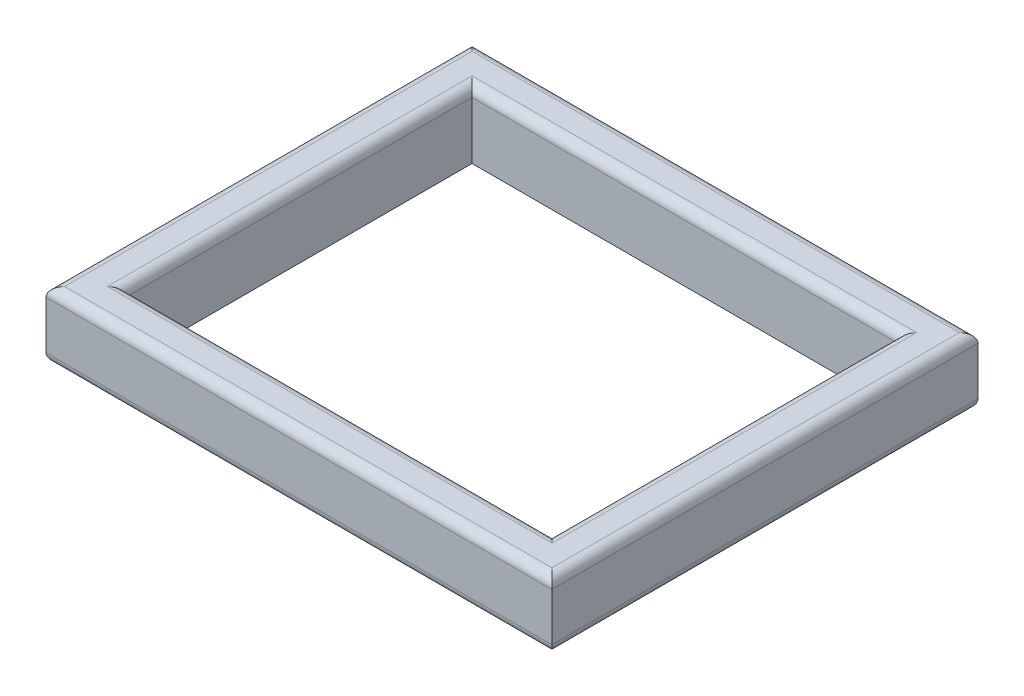
ISO-10303-21;
HEADER;
FILE_DESCRIPTION(('STEP AP214'),'2;1');
FILE_NAME('part.step','',(''),(''),'','','');
FILE_SCHEMA(('AUTOMOTIVE_DESIGN { 1 0 10303 214 1 1 1 1 }'));
ENDSEC;
DATA;
#1=APPLICATION_CONTEXT('core data for automotive mechanical design processes');
#2=APPLICATION_PROTOCOL_DEFINITION('international standard','automotive_design',2000,#1);
#3=PRODUCT_CONTEXT('',#1,'mechanical');
#4=PRODUCT('Part','Part','',(#3));
#5=PRODUCT_RELATED_PRODUCT_CATEGORY('part','',(#4));
#6=PRODUCT_DEFINITION_FORMATION('','',#4);
#7=PRODUCT_DEFINITION_CONTEXT('part definition',#1,'design');
#8=PRODUCT_DEFINITION('design','',#6,#7);
#9=PRODUCT_DEFINITION_SHAPE('','',#8);
#10=(LENGTH_UNIT() NAMED_UNIT(*) SI_UNIT(.MILLI.,.METRE.));
#11=(NAMED_UNIT(*) PLANE_ANGLE_UNIT() SI_UNIT($,.RADIAN.));
#12=(NAMED_UNIT(*) SI_UNIT($,.STERADIAN.) SOLID_ANGLE_UNIT());
#13=UNCERTAINTY_MEASURE_WITH_UNIT(LENGTH_MEASURE(1.E-05),#10,'distance_accuracy_value','');
#14=(GEOMETRIC_REPRESENTATION_CONTEXT(3) GLOBAL_UNCERTAINTY_ASSIGNED_CONTEXT((#13)) GLOBAL_UNIT_ASSIGNED_CONTEXT((#10,
#11,#12)) REPRESENTATION_CONTEXT('',''));
#15=CARTESIAN_POINT('',(0.,0.,0.));
#16=DIRECTION('',(0.,0.,1.));
#17=DIRECTION('',(1.,0.,0.));
#18=AXIS2_PLACEMENT_3D('',#15,#16,#17);
#19=CARTESIAN_POINT('',(0.,127.,0.));
#20=DIRECTION('',(0.,-1.,0.));
#21=DIRECTION('',(0.,0.,-1.));
#22=AXIS2_PLACEMENT_3D('',#19,#20,#21);
#23=PLANE('',#22);
#24=DIRECTION('',(0.,0.,1.));
#25=VECTOR('',#24,1.);
#26=CARTESIAN_POINT('',(-424.18,127.,-330.2));
#27=LINE('',#26,#25);
#28=CARTESIAN_POINT('',(-424.18,127.,347.98));
#29=VERTEX_POINT('',#28);
#30=CARTESIAN_POINT('',(-424.18,127.,-347.98));
#31=VERTEX_POINT('',#30);
#32=EDGE_CURVE('E229',#29,#31,#27,.F.);
#33=ORIENTED_EDGE('',*,*,#32,.T.);
#34=DIRECTION('',(-1.,0.,0.));
#35=VECTOR('',#34,1.);
#36=CARTESIAN_POINT('',(406.4,127.,-347.98));
#37=LINE('',#36,#35);
#38=CARTESIAN_POINT('',(424.18,127.,-347.98));
#39=VERTEX_POINT('',#38);
#40=EDGE_CURVE('E231',#31,#39,#37,.F.);
#41=ORIENTED_EDGE('',*,*,#40,.T.);
#42=DIRECTION('',(0.,0.,-1.));
#43=VECTOR('',#42,1.);
#44=CARTESIAN_POINT('',(424.18,127.,330.2));
#45=LINE('',#44,#43);
#46=CARTESIAN_POINT('',(424.18,127.,347.98));
#47=VERTEX_POINT('',#46);
#48=EDGE_CURVE('E225',#39,#47,#45,.F.);
#49=ORIENTED_EDGE('',*,*,#48,.T.);
#50=DIRECTION('',(1.,0.,0.));
#51=VECTOR('',#50,1.);
#52=CARTESIAN_POINT('',(-406.4,127.,347.98));
#53=LINE('',#52,#51);
#54=EDGE_CURVE('E227',#47,#29,#53,.F.);
#55=ORIENTED_EDGE('',*,*,#54,.T.);
#56=EDGE_LOOP('',(#33,#41,#49,#55));
#57=FACE_BOUND('',#56,.T.);
#58=DIRECTION('',(0.,0.,-1.));
#59=VECTOR('',#58,1.);
#60=CARTESIAN_POINT('',(464.82,127.,0.));
#61=LINE('',#60,#59);
#62=CARTESIAN_POINT('',(464.82,127.,388.62));
#63=VERTEX_POINT('',#62);
#64=CARTESIAN_POINT('',(464.82,127.,-388.62));
#65=VERTEX_POINT('',#64);
#66=EDGE_CURVE('E220',#63,#65,#61,.T.);
#67=ORIENTED_EDGE('',*,*,#66,.T.);
#68=DIRECTION('',(-1.,0.,0.));
#69=VECTOR('',#68,1.);
#70=CARTESIAN_POINT('',(0.,127.,-388.62));
#71=LINE('',#70,#69);
#72=CARTESIAN_POINT('',(-464.82,127.,-388.62));
#73=VERTEX_POINT('',#72);
#74=EDGE_CURVE('E222',#65,#73,#71,.T.);
#75=ORIENTED_EDGE('',*,*,#74,.T.);
#76=DIRECTION('',(0.,0.,1.));
#77=VECTOR('',#76,1.);
#78=CARTESIAN_POINT('',(-464.82,127.,0.));
#79=LINE('',#78,#77);
#80=CARTESIAN_POINT('',(-464.82,127.,388.62));
#81=VERTEX_POINT('',#80);
#82=EDGE_CURVE('E216',#73,#81,#79,.T.);
#83=ORIENTED_EDGE('',*,*,#82,.T.);
#84=DIRECTION('',(1.,0.,0.));
#85=VECTOR('',#84,1.);
#86=CARTESIAN_POINT('',(0.,127.,388.62));
#87=LINE('',#86,#85);
#88=EDGE_CURVE('E218',#81,#63,#87,.T.);
#89=ORIENTED_EDGE('',*,*,#88,.T.);
#90=EDGE_LOOP('',(#67,#75,#83,#89));
#91=FACE_BOUND('',#90,.T.);
#92=ADVANCED_FACE('F37',(#57,#91),#23,.F.);
#93=CARTESIAN_POINT('',(0.,0.,0.));
#94=DIRECTION('',(0.,-1.,0.));
#95=DIRECTION('',(0.,0.,-1.));
#96=AXIS2_PLACEMENT_3D('',#93,#94,#95);
#97=PLANE('',#96);
#98=DIRECTION('',(0.,0.,-1.));
#99=VECTOR('',#98,1.);
#100=CARTESIAN_POINT('',(464.82,0.,406.4));
#101=LINE('',#100,#99);
#102=CARTESIAN_POINT('',(464.82,0.,-388.62));
#103=VERTEX_POINT('',#102);
#104=CARTESIAN_POINT('',(464.82,0.,388.62));
#105=VERTEX_POINT('',#104);
#106=EDGE_CURVE('E196',#103,#105,#101,.F.);
#107=ORIENTED_EDGE('',*,*,#106,.T.);
#108=DIRECTION('',(1.,0.,0.));
#109=VECTOR('',#108,1.);
#110=CARTESIAN_POINT('',(-482.6,0.,388.62));
#111=LINE('',#110,#109);
#112=CARTESIAN_POINT('',(-464.82,0.,388.62));
#113=VERTEX_POINT('',#112);
#114=EDGE_CURVE('E198',#105,#113,#111,.F.);
#115=ORIENTED_EDGE('',*,*,#114,.T.);
#116=DIRECTION('',(0.,0.,1.));
#117=VECTOR('',#116,1.);
#118=CARTESIAN_POINT('',(-464.82,0.,-406.4));
#119=LINE('',#118,#117);
#120=CARTESIAN_POINT('',(-464.82,0.,-388.62));
#121=VERTEX_POINT('',#120);
#122=EDGE_CURVE('E192',#113,#121,#119,.F.);
#123=ORIENTED_EDGE('',*,*,#122,.T.);
#124=DIRECTION('',(-1.,0.,0.));
#125=VECTOR('',#124,1.);
#126=CARTESIAN_POINT('',(482.6,0.,-388.62));
#127=LINE('',#126,#125);
#128=EDGE_CURVE('E194',#121,#103,#127,.F.);
#129=ORIENTED_EDGE('',*,*,#128,.T.);
#130=EDGE_LOOP('',(#107,#115,#123,#129));
#131=FACE_BOUND('',#130,.T.);
#132=DIRECTION('',(1.,0.,0.));
#133=VECTOR('',#132,1.);
#134=CARTESIAN_POINT('',(-406.4,0.,330.2));
#135=LINE('',#134,#133);
#136=CARTESIAN_POINT('',(-406.4,0.,330.2));
#137=VERTEX_POINT('',#136);
#138=CARTESIAN_POINT('',(406.4,0.,330.2));
#139=VERTEX_POINT('',#138);
#140=EDGE_CURVE('E162',#137,#139,#135,.T.);
#141=ORIENTED_EDGE('',*,*,#140,.T.);
#142=DIRECTION('',(0.,0.,-1.));
#143=VECTOR('',#142,1.);
#144=CARTESIAN_POINT('',(406.4,0.,-330.2));
#145=LINE('',#144,#143);
#146=CARTESIAN_POINT('',(406.4,0.,-330.2));
#147=VERTEX_POINT('',#146);
#148=EDGE_CURVE('E143',#139,#147,#145,.T.);
#149=ORIENTED_EDGE('',*,*,#148,.T.);
#150=DIRECTION('',(-1.,0.,0.));
#151=VECTOR('',#150,1.);
#152=CARTESIAN_POINT('',(-406.4,0.,-330.2));
#153=LINE('',#152,#151);
#154=CARTESIAN_POINT('',(-406.4,0.,-330.2));
#155=VERTEX_POINT('',#154);
#156=EDGE_CURVE('E153',#147,#155,#153,.T.);
#157=ORIENTED_EDGE('',*,*,#156,.T.);
#158=DIRECTION('',(0.,0.,1.));
#159=VECTOR('',#158,1.);
#160=CARTESIAN_POINT('',(-406.4,0.,-330.2));
#161=LINE('',#160,#159);
#162=EDGE_CURVE('E158',#155,#137,#161,.T.);
#163=ORIENTED_EDGE('',*,*,#162,.T.);
#164=EDGE_LOOP('',(#141,#149,#157,#163));
#165=FACE_BOUND('',#164,.T.);
#166=ADVANCED_FACE('F160',(#131,#165),#97,.T.);
#167=CARTESIAN_POINT('',(-482.6,127.,-406.4));
#168=DIRECTION('',(1.,0.,0.));
#169=DIRECTION('',(0.,0.,-1.));
#170=AXIS2_PLACEMENT_3D('',#167,#168,#169);
#171=PLANE('',#170);
#172=DIRECTION('',(0.,-1.,0.));
#173=VECTOR('',#172,1.);
#174=CARTESIAN_POINT('',(-482.6,127.,-406.4));
#175=LINE('',#174,#173);
#176=CARTESIAN_POINT('',(-482.6,109.22,-406.4));
#177=VERTEX_POINT('',#176);
#178=CARTESIAN_POINT('',(-482.6,17.78,-406.4));
#179=VERTEX_POINT('',#178);
#180=EDGE_CURVE('E149',#177,#179,#175,.T.);
#181=ORIENTED_EDGE('',*,*,#180,.T.);
#182=DIRECTION('',(0.,0.,1.));
#183=VECTOR('',#182,1.);
#184=CARTESIAN_POINT('',(-482.6,17.78,406.4));
#185=LINE('',#184,#183);
#186=CARTESIAN_POINT('',(-482.6,17.78,406.4));
#187=VERTEX_POINT('',#186);
#188=EDGE_CURVE('E212',#179,#187,#185,.T.);
#189=ORIENTED_EDGE('',*,*,#188,.T.);
#190=DIRECTION('',(0.,-1.,0.));
#191=VECTOR('',#190,1.);
#192=CARTESIAN_POINT('',(-482.6,127.,406.4));
#193=LINE('',#192,#191);
#194=CARTESIAN_POINT('',(-482.6,109.22,406.4));
#195=VERTEX_POINT('',#194);
#196=EDGE_CURVE('E184',#195,#187,#193,.T.);
#197=ORIENTED_EDGE('',*,*,#196,.F.);
#198=DIRECTION('',(0.,0.,1.));
#199=VECTOR('',#198,1.);
#200=CARTESIAN_POINT('',(-482.6,109.22,-406.4));
#201=LINE('',#200,#199);
#202=EDGE_CURVE('E210',#195,#177,#201,.F.);
#203=ORIENTED_EDGE('',*,*,#202,.T.);
#204=EDGE_LOOP('',(#181,#189,#197,#203));
#205=FACE_BOUND('',#204,.T.);
#206=ADVANCED_FACE('F277',(#205),#171,.F.);
#207=CARTESIAN_POINT('',(482.6,127.,406.4));
#208=DIRECTION('',(0.,0.,-1.));
#209=DIRECTION('',(-1.,0.,0.));
#210=AXIS2_PLACEMENT_3D('',#207,#208,#209);
#211=PLANE('',#210);
#212=ORIENTED_EDGE('',*,*,#196,.T.);
#213=DIRECTION('',(1.,0.,0.));
#214=VECTOR('',#213,1.);
#215=CARTESIAN_POINT('',(482.6,17.78,406.4));
#216=LINE('',#215,#214);
#217=CARTESIAN_POINT('',(482.6,17.78,406.4));
#218=VERTEX_POINT('',#217);
#219=EDGE_CURVE('E189',#187,#218,#216,.T.);
#220=ORIENTED_EDGE('',*,*,#219,.T.);
#221=DIRECTION('',(0.,-1.,0.));
#222=VECTOR('',#221,1.);
#223=CARTESIAN_POINT('',(482.6,127.,406.4));
#224=LINE('',#223,#222);
#225=CARTESIAN_POINT('',(482.6,109.22,406.4));
#226=VERTEX_POINT('',#225);
#227=EDGE_CURVE('E181',#226,#218,#224,.T.);
#228=ORIENTED_EDGE('',*,*,#227,.F.);
#229=DIRECTION('',(1.,0.,0.));
#230=VECTOR('',#229,1.);
#231=CARTESIAN_POINT('',(482.6,109.22,406.4));
#232=LINE('',#231,#230);
#233=EDGE_CURVE('E187',#226,#195,#232,.F.);
#234=ORIENTED_EDGE('',*,*,#233,.T.);
#235=EDGE_LOOP('',(#212,#220,#228,#234));
#236=FACE_BOUND('',#235,.T.);
#237=ADVANCED_FACE('F274',(#236),#211,.F.);
#238=CARTESIAN_POINT('',(482.6,127.,-406.4));
#239=DIRECTION('',(-1.,0.,0.));
#240=DIRECTION('',(0.,0.,1.));
#241=AXIS2_PLACEMENT_3D('',#238,#239,#240);
#242=PLANE('',#241);
#243=ORIENTED_EDGE('',*,*,#227,.T.);
#244=DIRECTION('',(0.,0.,-1.));
#245=VECTOR('',#244,1.);
#246=CARTESIAN_POINT('',(482.6,17.78,-406.4));
#247=LINE('',#246,#245);
#248=CARTESIAN_POINT('',(482.6,17.78,-406.4));
#249=VERTEX_POINT('',#248);
#250=EDGE_CURVE('E203',#218,#249,#247,.T.);
#251=ORIENTED_EDGE('',*,*,#250,.T.);
#252=DIRECTION('',(0.,-1.,0.));
#253=VECTOR('',#252,1.);
#254=CARTESIAN_POINT('',(482.6,127.,-406.4));
#255=LINE('',#254,#253);
#256=CARTESIAN_POINT('',(482.6,109.22,-406.4));
#257=VERTEX_POINT('',#256);
#258=EDGE_CURVE('E178',#257,#249,#255,.T.);
#259=ORIENTED_EDGE('',*,*,#258,.F.);
#260=DIRECTION('',(0.,0.,-1.));
#261=VECTOR('',#260,1.);
#262=CARTESIAN_POINT('',(482.6,109.22,-406.4));
#263=LINE('',#262,#261);
#264=EDGE_CURVE('E201',#257,#226,#263,.F.);
#265=ORIENTED_EDGE('',*,*,#264,.T.);
#266=EDGE_LOOP('',(#243,#251,#259,#265));
#267=FACE_BOUND('',#266,.T.);
#268=ADVANCED_FACE('F291',(#267),#242,.F.);
#269=CARTESIAN_POINT('',(482.6,127.,-406.4));
#270=DIRECTION('',(0.,0.,1.));
#271=DIRECTION('',(1.,0.,0.));
#272=AXIS2_PLACEMENT_3D('',#269,#270,#271);
#273=PLANE('',#272);
#274=ORIENTED_EDGE('',*,*,#258,.T.);
#275=DIRECTION('',(-1.,0.,0.));
#276=VECTOR('',#275,1.);
#277=CARTESIAN_POINT('',(-482.6,17.78,-406.4));
#278=LINE('',#277,#276);
#279=EDGE_CURVE('E208',#249,#179,#278,.T.);
#280=ORIENTED_EDGE('',*,*,#279,.T.);
#281=ORIENTED_EDGE('',*,*,#180,.F.);
#282=DIRECTION('',(-1.,0.,0.));
#283=VECTOR('',#282,1.);
#284=CARTESIAN_POINT('',(482.6,109.22,-406.4));
#285=LINE('',#284,#283);
#286=EDGE_CURVE('E205',#177,#257,#285,.F.);
#287=ORIENTED_EDGE('',*,*,#286,.T.);
#288=EDGE_LOOP('',(#274,#280,#281,#287));
#289=FACE_BOUND('',#288,.T.);
#290=ADVANCED_FACE('F295',(#289),#273,.F.);
#291=CARTESIAN_POINT('',(406.4,127.,-330.2));
#292=DIRECTION('',(-1.,0.,0.));
#293=DIRECTION('',(0.,0.,1.));
#294=AXIS2_PLACEMENT_3D('',#291,#292,#293);
#295=PLANE('',#294);
#296=DIRECTION('',(0.,-1.,0.));
#297=VECTOR('',#296,1.);
#298=CARTESIAN_POINT('',(406.4,127.,330.2));
#299=LINE('',#298,#297);
#300=CARTESIAN_POINT('',(406.4,109.22,330.2));
#301=VERTEX_POINT('',#300);
#302=EDGE_CURVE('E171',#301,#139,#299,.T.);
#303=ORIENTED_EDGE('',*,*,#302,.F.);
#304=DIRECTION('',(0.,0.,-1.));
#305=VECTOR('',#304,1.);
#306=CARTESIAN_POINT('',(406.4,109.22,-330.2));
#307=LINE('',#306,#305);
#308=CARTESIAN_POINT('',(406.4,109.22,-330.2));
#309=VERTEX_POINT('',#308);
#310=EDGE_CURVE('E11',#301,#309,#307,.T.);
#311=ORIENTED_EDGE('',*,*,#310,.T.);
#312=DIRECTION('',(0.,-1.,0.));
#313=VECTOR('',#312,1.);
#314=CARTESIAN_POINT('',(406.4,127.,-330.2));
#315=LINE('',#314,#313);
#316=EDGE_CURVE('E139',#309,#147,#315,.T.);
#317=ORIENTED_EDGE('',*,*,#316,.T.);
#318=ORIENTED_EDGE('',*,*,#148,.F.);
#319=EDGE_LOOP('',(#303,#311,#317,#318));
#320=FACE_BOUND('',#319,.T.);
#321=ADVANCED_FACE('F141',(#320),#295,.T.);
#322=CARTESIAN_POINT('',(-406.4,127.,-330.2));
#323=DIRECTION('',(0.,0.,1.));
#324=DIRECTION('',(1.,0.,0.));
#325=AXIS2_PLACEMENT_3D('',#322,#323,#324);
#326=PLANE('',#325);
#327=ORIENTED_EDGE('',*,*,#316,.F.);
#328=DIRECTION('',(-1.,0.,0.));
#329=VECTOR('',#328,1.);
#330=CARTESIAN_POINT('',(-406.4,109.22,-330.2));
#331=LINE('',#330,#329);
#332=CARTESIAN_POINT('',(-406.4,109.22,-330.2));
#333=VERTEX_POINT('',#332);
#334=EDGE_CURVE('E214',#309,#333,#331,.T.);
#335=ORIENTED_EDGE('',*,*,#334,.T.);
#336=DIRECTION('',(0.,-1.,0.));
#337=VECTOR('',#336,1.);
#338=CARTESIAN_POINT('',(-406.4,127.,-330.2));
#339=LINE('',#338,#337);
#340=EDGE_CURVE('E150',#333,#155,#339,.T.);
#341=ORIENTED_EDGE('',*,*,#340,.T.);
#342=ORIENTED_EDGE('',*,*,#156,.F.);
#343=EDGE_LOOP('',(#327,#335,#341,#342));
#344=FACE_BOUND('',#343,.T.);
#345=ADVANCED_FACE('F154',(#344),#326,.T.);
#346=CARTESIAN_POINT('',(-406.4,127.,-330.2));
#347=DIRECTION('',(1.,0.,0.));
#348=DIRECTION('',(0.,0.,-1.));
#349=AXIS2_PLACEMENT_3D('',#346,#347,#348);
#350=PLANE('',#349);
#351=ORIENTED_EDGE('',*,*,#340,.F.);
#352=DIRECTION('',(0.,0.,1.));
#353=VECTOR('',#352,1.);
#354=CARTESIAN_POINT('',(-406.4,109.22,330.2));
#355=LINE('',#354,#353);
#356=CARTESIAN_POINT('',(-406.4,109.22,330.2));
#357=VERTEX_POINT('',#356);
#358=EDGE_CURVE('E61',#333,#357,#355,.T.);
#359=ORIENTED_EDGE('',*,*,#358,.T.);
#360=DIRECTION('',(0.,-1.,0.));
#361=VECTOR('',#360,1.);
#362=CARTESIAN_POINT('',(-406.4,127.,330.2));
#363=LINE('',#362,#361);
#364=EDGE_CURVE('E173',#357,#137,#363,.T.);
#365=ORIENTED_EDGE('',*,*,#364,.T.);
#366=ORIENTED_EDGE('',*,*,#162,.F.);
#367=EDGE_LOOP('',(#351,#359,#365,#366));
#368=FACE_BOUND('',#367,.T.);
#369=ADVANCED_FACE('F397',(#368),#350,.T.);
#370=CARTESIAN_POINT('',(-406.4,127.,330.2));
#371=DIRECTION('',(0.,0.,-1.));
#372=DIRECTION('',(-1.,0.,0.));
#373=AXIS2_PLACEMENT_3D('',#370,#371,#372);
#374=PLANE('',#373);
#375=ORIENTED_EDGE('',*,*,#364,.F.);
#376=DIRECTION('',(1.,0.,0.));
#377=VECTOR('',#376,1.);
#378=CARTESIAN_POINT('',(406.4,109.22,330.2));
#379=LINE('',#378,#377);
#380=EDGE_CURVE('E46',#357,#301,#379,.T.);
#381=ORIENTED_EDGE('',*,*,#380,.T.);
#382=ORIENTED_EDGE('',*,*,#302,.T.);
#383=ORIENTED_EDGE('',*,*,#140,.F.);
#384=EDGE_LOOP('',(#375,#381,#382,#383));
#385=FACE_BOUND('',#384,.T.);
#386=ADVANCED_FACE('F331',(#385),#374,.T.);
#387=CARTESIAN_POINT('',(482.6,17.78,-388.62));
#388=DIRECTION('',(1.,0.,0.));
#389=DIRECTION('',(0.,0.,-1.));
#390=AXIS2_PLACEMENT_3D('',#387,#388,#389);
#391=CYLINDRICAL_SURFACE('',#390,17.78);
#392=CARTESIAN_POINT('',(464.82,17.78,-388.62));
#393=DIRECTION('',(0.707106781186547,0.,0.707106781186547));
#394=DIRECTION('',(0.707106781186547,0.,-0.707106781186547));
#395=AXIS2_PLACEMENT_3D('',#392,#393,#394);
#396=ELLIPSE('',#395,25.1447171389936,17.78);
#397=EDGE_CURVE('E166',#103,#249,#396,.T.);
#398=ORIENTED_EDGE('',*,*,#397,.F.);
#399=ORIENTED_EDGE('',*,*,#128,.F.);
#400=CARTESIAN_POINT('',(-464.82,17.78,-388.62));
#401=DIRECTION('',(0.707106781186547,0.,-0.707106781186547));
#402=DIRECTION('',(-0.707106781186547,0.,-0.707106781186547));
#403=AXIS2_PLACEMENT_3D('',#400,#401,#402);
#404=ELLIPSE('',#403,25.1447171389936,17.78);
#405=EDGE_CURVE('E163',#179,#121,#404,.F.);
#406=ORIENTED_EDGE('',*,*,#405,.F.);
#407=ORIENTED_EDGE('',*,*,#279,.F.);
#408=EDGE_LOOP('',(#398,#399,#406,#407));
#409=FACE_BOUND('',#408,.T.);
#410=ADVANCED_FACE('F299',(#409),#391,.T.);
#411=CARTESIAN_POINT('',(-464.82,17.78,-406.4));
#412=DIRECTION('',(0.,0.,-1.));
#413=DIRECTION('',(-1.,0.,0.));
#414=AXIS2_PLACEMENT_3D('',#411,#412,#413);
#415=CYLINDRICAL_SURFACE('',#414,17.78);
#416=ORIENTED_EDGE('',*,*,#405,.T.);
#417=ORIENTED_EDGE('',*,*,#122,.F.);
#418=CARTESIAN_POINT('',(-464.82,17.78,388.62));
#419=DIRECTION('',(-0.707106781186547,0.,-0.707106781186547));
#420=DIRECTION('',(0.707106781186547,0.,-0.707106781186547));
#421=AXIS2_PLACEMENT_3D('',#418,#419,#420);
#422=ELLIPSE('',#421,25.1447171389936,17.78);
#423=EDGE_CURVE('E238',#187,#113,#422,.F.);
#424=ORIENTED_EDGE('',*,*,#423,.F.);
#425=ORIENTED_EDGE('',*,*,#188,.F.);
#426=EDGE_LOOP('',(#416,#417,#424,#425));
#427=FACE_BOUND('',#426,.T.);
#428=ADVANCED_FACE('F282',(#427),#415,.T.);
#429=CARTESIAN_POINT('',(464.82,17.78,-406.4));
#430=DIRECTION('',(0.,0.,1.));
#431=DIRECTION('',(1.,0.,0.));
#432=AXIS2_PLACEMENT_3D('',#429,#430,#431);
#433=CYLINDRICAL_SURFACE('',#432,17.78);
#434=ORIENTED_EDGE('',*,*,#397,.T.);
#435=ORIENTED_EDGE('',*,*,#250,.F.);
#436=CARTESIAN_POINT('',(464.82,17.78,388.62));
#437=DIRECTION('',(-0.707106781186547,0.,0.707106781186547));
#438=DIRECTION('',(0.707106781186547,0.,0.707106781186547));
#439=AXIS2_PLACEMENT_3D('',#436,#437,#438);
#440=ELLIPSE('',#439,25.1447171389936,17.78);
#441=EDGE_CURVE('E236',#105,#218,#440,.T.);
#442=ORIENTED_EDGE('',*,*,#441,.F.);
#443=ORIENTED_EDGE('',*,*,#106,.F.);
#444=EDGE_LOOP('',(#434,#435,#442,#443));
#445=FACE_BOUND('',#444,.T.);
#446=ADVANCED_FACE('F303',(#445),#433,.T.);
#447=CARTESIAN_POINT('',(482.6,17.78,388.62));
#448=DIRECTION('',(-1.,0.,0.));
#449=DIRECTION('',(0.,0.,1.));
#450=AXIS2_PLACEMENT_3D('',#447,#448,#449);
#451=CYLINDRICAL_SURFACE('',#450,17.78);
#452=ORIENTED_EDGE('',*,*,#423,.T.);
#453=ORIENTED_EDGE('',*,*,#114,.F.);
#454=ORIENTED_EDGE('',*,*,#441,.T.);
#455=ORIENTED_EDGE('',*,*,#219,.F.);
#456=EDGE_LOOP('',(#452,#453,#454,#455));
#457=FACE_BOUND('',#456,.T.);
#458=ADVANCED_FACE('F287',(#457),#451,.T.);
#459=CARTESIAN_POINT('',(-406.4,109.22,347.98));
#460=DIRECTION('',(-1.,0.,0.));
#461=DIRECTION('',(0.,0.,1.));
#462=AXIS2_PLACEMENT_3D('',#459,#460,#461);
#463=CYLINDRICAL_SURFACE('',#462,17.78);
#464=CARTESIAN_POINT('',(-424.18,109.22,347.98));
#465=DIRECTION('',(-0.707106781186547,0.,-0.707106781186547));
#466=DIRECTION('',(0.707106781186547,0.,-0.707106781186547));
#467=AXIS2_PLACEMENT_3D('',#464,#465,#466);
#468=ELLIPSE('',#467,25.1447171389936,17.78);
#469=EDGE_CURVE('E247',#29,#357,#468,.T.);
#470=ORIENTED_EDGE('',*,*,#469,.F.);
#471=ORIENTED_EDGE('',*,*,#54,.F.);
#472=CARTESIAN_POINT('',(424.18,109.22,347.98));
#473=DIRECTION('',(-0.707106781186547,0.,0.707106781186547));
#474=DIRECTION('',(-0.707106781186547,0.,-0.707106781186547));
#475=AXIS2_PLACEMENT_3D('',#472,#473,#474);
#476=ELLIPSE('',#475,25.1447171389936,17.78);
#477=EDGE_CURVE('E239',#301,#47,#476,.F.);
#478=ORIENTED_EDGE('',*,*,#477,.F.);
#479=ORIENTED_EDGE('',*,*,#380,.F.);
#480=EDGE_LOOP('',(#470,#471,#478,#479));
#481=FACE_BOUND('',#480,.T.);
#482=ADVANCED_FACE('F324',(#481),#463,.T.);
#483=CARTESIAN_POINT('',(424.18,109.22,-330.2));
#484=DIRECTION('',(0.,0.,1.));
#485=DIRECTION('',(1.,0.,0.));
#486=AXIS2_PLACEMENT_3D('',#483,#484,#485);
#487=CYLINDRICAL_SURFACE('',#486,17.78);
#488=ORIENTED_EDGE('',*,*,#477,.T.);
#489=ORIENTED_EDGE('',*,*,#48,.F.);
#490=CARTESIAN_POINT('',(424.18,109.22,-347.98));
#491=DIRECTION('',(0.707106781186547,0.,0.707106781186547));
#492=DIRECTION('',(0.707106781186547,0.,-0.707106781186547));
#493=AXIS2_PLACEMENT_3D('',#490,#491,#492);
#494=ELLIPSE('',#493,25.1447171389936,17.78);
#495=EDGE_CURVE('E245',#309,#39,#494,.F.);
#496=ORIENTED_EDGE('',*,*,#495,.F.);
#497=ORIENTED_EDGE('',*,*,#310,.F.);
#498=EDGE_LOOP('',(#488,#489,#496,#497));
#499=FACE_BOUND('',#498,.T.);
#500=ADVANCED_FACE('F339',(#499),#487,.T.);
#501=CARTESIAN_POINT('',(-424.18,109.22,-330.2));
#502=DIRECTION('',(0.,0.,-1.));
#503=DIRECTION('',(-1.,0.,0.));
#504=AXIS2_PLACEMENT_3D('',#501,#502,#503);
#505=CYLINDRICAL_SURFACE('',#504,17.78);
#506=ORIENTED_EDGE('',*,*,#469,.T.);
#507=ORIENTED_EDGE('',*,*,#358,.F.);
#508=CARTESIAN_POINT('',(-424.18,109.22,-347.98));
#509=DIRECTION('',(0.707106781186547,0.,-0.707106781186547));
#510=DIRECTION('',(0.707106781186547,0.,0.707106781186547));
#511=AXIS2_PLACEMENT_3D('',#508,#509,#510);
#512=ELLIPSE('',#511,25.1447171389936,17.78);
#513=EDGE_CURVE('E243',#31,#333,#512,.T.);
#514=ORIENTED_EDGE('',*,*,#513,.F.);
#515=ORIENTED_EDGE('',*,*,#32,.F.);
#516=EDGE_LOOP('',(#506,#507,#514,#515));
#517=FACE_BOUND('',#516,.T.);
#518=ADVANCED_FACE('F335',(#517),#505,.T.);
#519=CARTESIAN_POINT('',(-406.4,109.22,-347.98));
#520=DIRECTION('',(1.,0.,0.));
#521=DIRECTION('',(0.,0.,-1.));
#522=AXIS2_PLACEMENT_3D('',#519,#520,#521);
#523=CYLINDRICAL_SURFACE('',#522,17.78);
#524=ORIENTED_EDGE('',*,*,#495,.T.);
#525=ORIENTED_EDGE('',*,*,#40,.F.);
#526=ORIENTED_EDGE('',*,*,#513,.T.);
#527=ORIENTED_EDGE('',*,*,#334,.F.);
#528=EDGE_LOOP('',(#524,#525,#526,#527));
#529=FACE_BOUND('',#528,.T.);
#530=ADVANCED_FACE('F332',(#529),#523,.T.);
#531=CARTESIAN_POINT('',(0.,109.22,388.62));
#532=DIRECTION('',(1.,0.,0.));
#533=DIRECTION('',(0.,0.,-1.));
#534=AXIS2_PLACEMENT_3D('',#531,#532,#533);
#535=CYLINDRICAL_SURFACE('',#534,17.78);
#536=CARTESIAN_POINT('',(-464.82,109.22,388.62));
#537=DIRECTION('',(0.707106781186547,0.,0.707106781186547));
#538=DIRECTION('',(-0.707106781186547,0.,0.707106781186547));
#539=AXIS2_PLACEMENT_3D('',#536,#537,#538);
#540=ELLIPSE('',#539,25.1447171389936,17.78);
#541=EDGE_CURVE('E255',#195,#81,#540,.F.);
#542=ORIENTED_EDGE('',*,*,#541,.F.);
#543=ORIENTED_EDGE('',*,*,#233,.F.);
#544=CARTESIAN_POINT('',(464.82,109.22,388.62));
#545=DIRECTION('',(0.707106781186547,0.,-0.707106781186547));
#546=DIRECTION('',(0.707106781186547,0.,0.707106781186547));
#547=AXIS2_PLACEMENT_3D('',#544,#545,#546);
#548=ELLIPSE('',#547,25.1447171389936,17.78);
#549=EDGE_CURVE('E41',#63,#226,#548,.T.);
#550=ORIENTED_EDGE('',*,*,#549,.F.);
#551=ORIENTED_EDGE('',*,*,#88,.F.);
#552=EDGE_LOOP('',(#542,#543,#550,#551));
#553=FACE_BOUND('',#552,.T.);
#554=ADVANCED_FACE('F39',(#553),#535,.T.);
#555=CARTESIAN_POINT('',(464.82,109.22,0.));
#556=DIRECTION('',(0.,0.,-1.));
#557=DIRECTION('',(-1.,0.,0.));
#558=AXIS2_PLACEMENT_3D('',#555,#556,#557);
#559=CYLINDRICAL_SURFACE('',#558,17.78);
#560=ORIENTED_EDGE('',*,*,#549,.T.);
#561=ORIENTED_EDGE('',*,*,#264,.F.);
#562=CARTESIAN_POINT('',(464.82,109.22,-388.62));
#563=DIRECTION('',(-0.707106781186547,0.,-0.707106781186547));
#564=DIRECTION('',(0.707106781186547,0.,-0.707106781186547));
#565=AXIS2_PLACEMENT_3D('',#562,#563,#564);
#566=ELLIPSE('',#565,25.1447171389936,17.78);
#567=EDGE_CURVE('E254',#65,#257,#566,.T.);
#568=ORIENTED_EDGE('',*,*,#567,.F.);
#569=ORIENTED_EDGE('',*,*,#66,.F.);
#570=EDGE_LOOP('',(#560,#561,#568,#569));
#571=FACE_BOUND('',#570,.T.);
#572=ADVANCED_FACE('F266',(#571),#559,.T.);
#573=CARTESIAN_POINT('',(-464.82,109.22,0.));
#574=DIRECTION('',(0.,0.,1.));
#575=DIRECTION('',(1.,0.,0.));
#576=AXIS2_PLACEMENT_3D('',#573,#574,#575);
#577=CYLINDRICAL_SURFACE('',#576,17.78);
#578=ORIENTED_EDGE('',*,*,#541,.T.);
#579=ORIENTED_EDGE('',*,*,#82,.F.);
#580=CARTESIAN_POINT('',(-464.82,109.22,-388.62));
#581=DIRECTION('',(-0.707106781186547,0.,0.707106781186547));
#582=DIRECTION('',(0.707106781186547,0.,0.707106781186547));
#583=AXIS2_PLACEMENT_3D('',#580,#581,#582);
#584=ELLIPSE('',#583,25.1447171389936,17.78);
#585=EDGE_CURVE('E252',#177,#73,#584,.F.);
#586=ORIENTED_EDGE('',*,*,#585,.F.);
#587=ORIENTED_EDGE('',*,*,#202,.F.);
#588=EDGE_LOOP('',(#578,#579,#586,#587));
#589=FACE_BOUND('',#588,.T.);
#590=ADVANCED_FACE('F350',(#589),#577,.T.);
#591=CARTESIAN_POINT('',(0.,109.22,-388.62));
#592=DIRECTION('',(-1.,0.,0.));
#593=DIRECTION('',(0.,0.,1.));
#594=AXIS2_PLACEMENT_3D('',#591,#592,#593);
#595=CYLINDRICAL_SURFACE('',#594,17.78);
#596=ORIENTED_EDGE('',*,*,#567,.T.);
#597=ORIENTED_EDGE('',*,*,#286,.F.);
#598=ORIENTED_EDGE('',*,*,#585,.T.);
#599=ORIENTED_EDGE('',*,*,#74,.F.);
#600=EDGE_LOOP('',(#596,#597,#598,#599));
#601=FACE_BOUND('',#600,.T.);
#602=ADVANCED_FACE('F347',(#601),#595,.T.);
#603=CLOSED_SHELL('',(#92,#166,#206,#237,#268,#290,#321,#345,#369,#386,#410,#428,#446,#458,#482,
#500,#518,#530,#554,#572,#590,#602));
#604=MANIFOLD_SOLID_BREP('B2',#603);
#605=ADVANCED_BREP_SHAPE_REPRESENTATION('',(#18,#604),#14);
#606=SHAPE_DEFINITION_REPRESENTATION(#9,#605);
ENDSEC;
END-ISO-10303-21;
